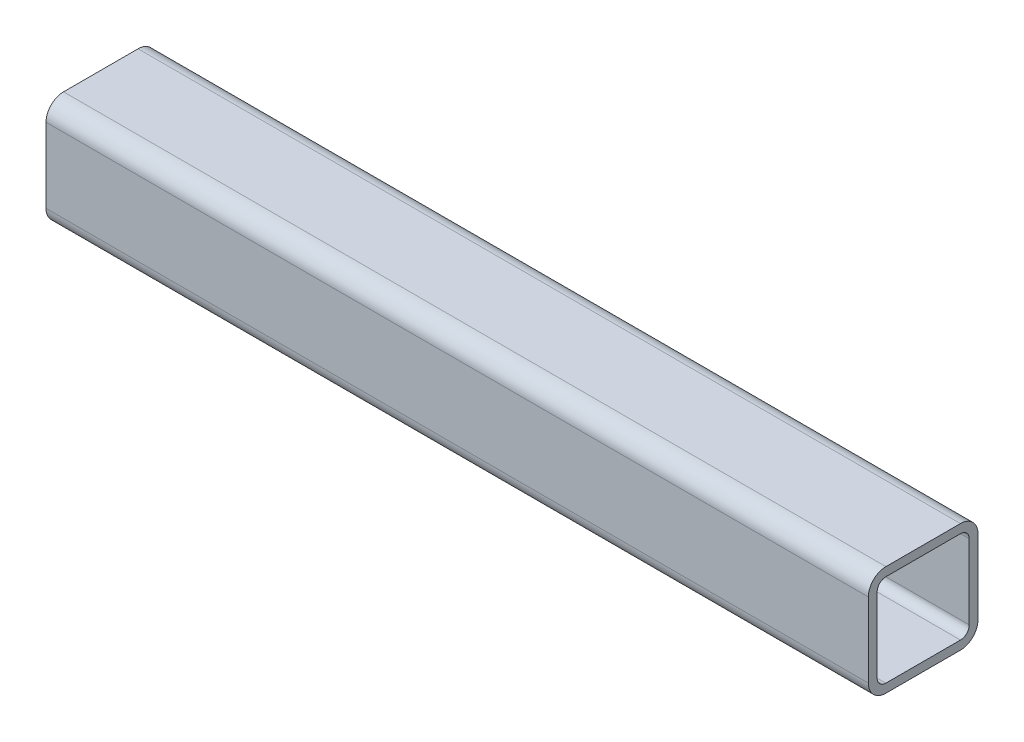
ISO-10303-21;
HEADER;
FILE_DESCRIPTION(('STEP AP214'),'2;1');
FILE_NAME('part.step','',(''),(''),'','','');
FILE_SCHEMA(('AUTOMOTIVE_DESIGN { 1 0 10303 214 1 1 1 1 }'));
ENDSEC;
DATA;
#1=APPLICATION_CONTEXT('core data for automotive mechanical design processes');
#2=APPLICATION_PROTOCOL_DEFINITION('international standard','automotive_design',2000,#1);
#3=PRODUCT_CONTEXT('',#1,'mechanical');
#4=PRODUCT('Part','Part','',(#3));
#5=PRODUCT_RELATED_PRODUCT_CATEGORY('part','',(#4));
#6=PRODUCT_DEFINITION_FORMATION('','',#4);
#7=PRODUCT_DEFINITION_CONTEXT('part definition',#1,'design');
#8=PRODUCT_DEFINITION('design','',#6,#7);
#9=PRODUCT_DEFINITION_SHAPE('','',#8);
#10=(LENGTH_UNIT() NAMED_UNIT(*) SI_UNIT(.MILLI.,.METRE.));
#11=(NAMED_UNIT(*) PLANE_ANGLE_UNIT() SI_UNIT($,.RADIAN.));
#12=(NAMED_UNIT(*) SI_UNIT($,.STERADIAN.) SOLID_ANGLE_UNIT());
#13=UNCERTAINTY_MEASURE_WITH_UNIT(LENGTH_MEASURE(1.E-05),#10,'distance_accuracy_value','');
#14=(GEOMETRIC_REPRESENTATION_CONTEXT(3) GLOBAL_UNCERTAINTY_ASSIGNED_CONTEXT((#13)) GLOBAL_UNIT_ASSIGNED_CONTEXT((#10,
#11,#12)) REPRESENTATION_CONTEXT('',''));
#15=CARTESIAN_POINT('',(0.,0.,0.));
#16=DIRECTION('',(0.,0.,1.));
#17=DIRECTION('',(1.,0.,0.));
#18=AXIS2_PLACEMENT_3D('',#15,#16,#17);
#19=CARTESIAN_POINT('',(300.,13.6,-13.6));
#20=DIRECTION('',(-1.,0.,0.));
#21=DIRECTION('',(0.,0.,1.));
#22=AXIS2_PLACEMENT_3D('',#19,#20,#21);
#23=CYLINDRICAL_SURFACE('',#22,6.4);
#24=CARTESIAN_POINT('',(0.,13.6,-13.6));
#25=DIRECTION('',(1.,0.,0.));
#26=DIRECTION('',(0.,0.,-1.));
#27=AXIS2_PLACEMENT_3D('',#24,#25,#26);
#28=CIRCLE('',#27,6.4);
#29=CARTESIAN_POINT('',(0.,13.6,-20.));
#30=VERTEX_POINT('',#29);
#31=CARTESIAN_POINT('',(0.,20.,-13.6));
#32=VERTEX_POINT('',#31);
#33=EDGE_CURVE('E234',#30,#32,#28,.T.);
#34=ORIENTED_EDGE('',*,*,#33,.T.);
#35=DIRECTION('',(-1.,0.,0.));
#36=VECTOR('',#35,1.);
#37=CARTESIAN_POINT('',(300.,20.,-13.6));
#38=LINE('',#37,#36);
#39=CARTESIAN_POINT('',(300.,20.,-13.6));
#40=VERTEX_POINT('',#39);
#41=EDGE_CURVE('E12',#40,#32,#38,.T.);
#42=ORIENTED_EDGE('',*,*,#41,.F.);
#43=CARTESIAN_POINT('',(300.,13.6,-13.6));
#44=DIRECTION('',(1.,0.,0.));
#45=DIRECTION('',(0.,0.,-1.));
#46=AXIS2_PLACEMENT_3D('',#43,#44,#45);
#47=CIRCLE('',#46,6.4);
#48=CARTESIAN_POINT('',(300.,13.6,-20.));
#49=VERTEX_POINT('',#48);
#50=EDGE_CURVE('E312',#49,#40,#47,.T.);
#51=ORIENTED_EDGE('',*,*,#50,.F.);
#52=DIRECTION('',(-1.,0.,0.));
#53=VECTOR('',#52,1.);
#54=CARTESIAN_POINT('',(300.,13.6,-20.));
#55=LINE('',#54,#53);
#56=EDGE_CURVE('E249',#49,#30,#55,.T.);
#57=ORIENTED_EDGE('',*,*,#56,.T.);
#58=EDGE_LOOP('',(#34,#42,#51,#57));
#59=FACE_BOUND('',#58,.T.);
#60=ADVANCED_FACE('F62',(#59),#23,.T.);
#61=CARTESIAN_POINT('',(300.,20.,-13.6));
#62=DIRECTION('',(0.,-1.,0.));
#63=DIRECTION('',(0.,0.,-1.));
#64=AXIS2_PLACEMENT_3D('',#61,#62,#63);
#65=PLANE('',#64);
#66=DIRECTION('',(0.,0.,1.));
#67=VECTOR('',#66,1.);
#68=CARTESIAN_POINT('',(0.,20.,-13.6));
#69=LINE('',#68,#67);
#70=CARTESIAN_POINT('',(0.,20.,13.6));
#71=VERTEX_POINT('',#70);
#72=EDGE_CURVE('E237',#32,#71,#69,.T.);
#73=ORIENTED_EDGE('',*,*,#72,.T.);
#74=DIRECTION('',(-1.,0.,0.));
#75=VECTOR('',#74,1.);
#76=CARTESIAN_POINT('',(300.,20.,13.6));
#77=LINE('',#76,#75);
#78=CARTESIAN_POINT('',(300.,20.,13.6));
#79=VERTEX_POINT('',#78);
#80=EDGE_CURVE('E72',#79,#71,#77,.T.);
#81=ORIENTED_EDGE('',*,*,#80,.F.);
#82=DIRECTION('',(0.,0.,1.));
#83=VECTOR('',#82,1.);
#84=CARTESIAN_POINT('',(300.,20.,-13.6));
#85=LINE('',#84,#83);
#86=EDGE_CURVE('E314',#40,#79,#85,.T.);
#87=ORIENTED_EDGE('',*,*,#86,.F.);
#88=ORIENTED_EDGE('',*,*,#41,.T.);
#89=EDGE_LOOP('',(#73,#81,#87,#88));
#90=FACE_BOUND('',#89,.T.);
#91=ADVANCED_FACE('F349',(#90),#65,.F.);
#92=CARTESIAN_POINT('',(300.,13.6,13.6));
#93=DIRECTION('',(-1.,0.,0.));
#94=DIRECTION('',(0.,0.,1.));
#95=AXIS2_PLACEMENT_3D('',#92,#93,#94);
#96=CYLINDRICAL_SURFACE('',#95,6.4);
#97=CARTESIAN_POINT('',(0.,13.6,13.6));
#98=DIRECTION('',(1.,0.,0.));
#99=DIRECTION('',(0.,0.,-1.));
#100=AXIS2_PLACEMENT_3D('',#97,#98,#99);
#101=CIRCLE('',#100,6.4);
#102=CARTESIAN_POINT('',(0.,13.6,20.));
#103=VERTEX_POINT('',#102);
#104=EDGE_CURVE('E239',#71,#103,#101,.T.);
#105=ORIENTED_EDGE('',*,*,#104,.T.);
#106=DIRECTION('',(-1.,0.,0.));
#107=VECTOR('',#106,1.);
#108=CARTESIAN_POINT('',(300.,13.6,20.));
#109=LINE('',#108,#107);
#110=CARTESIAN_POINT('',(300.,13.6,20.));
#111=VERTEX_POINT('',#110);
#112=EDGE_CURVE('E256',#111,#103,#109,.T.);
#113=ORIENTED_EDGE('',*,*,#112,.F.);
#114=CARTESIAN_POINT('',(300.,13.6,13.6));
#115=DIRECTION('',(1.,0.,0.));
#116=DIRECTION('',(0.,0.,-1.));
#117=AXIS2_PLACEMENT_3D('',#114,#115,#116);
#118=CIRCLE('',#117,6.4);
#119=EDGE_CURVE('E316',#79,#111,#118,.T.);
#120=ORIENTED_EDGE('',*,*,#119,.F.);
#121=ORIENTED_EDGE('',*,*,#80,.T.);
#122=EDGE_LOOP('',(#105,#113,#120,#121));
#123=FACE_BOUND('',#122,.T.);
#124=ADVANCED_FACE('F354',(#123),#96,.T.);
#125=CARTESIAN_POINT('',(300.,-13.6,20.));
#126=DIRECTION('',(0.,0.,-1.));
#127=DIRECTION('',(0.,1.,0.));
#128=AXIS2_PLACEMENT_3D('',#125,#126,#127);
#129=PLANE('',#128);
#130=DIRECTION('',(0.,-1.,0.));
#131=VECTOR('',#130,1.);
#132=CARTESIAN_POINT('',(0.,-13.6,20.));
#133=LINE('',#132,#131);
#134=CARTESIAN_POINT('',(0.,-13.6,20.));
#135=VERTEX_POINT('',#134);
#136=EDGE_CURVE('E241',#103,#135,#133,.T.);
#137=ORIENTED_EDGE('',*,*,#136,.T.);
#138=DIRECTION('',(-1.,0.,0.));
#139=VECTOR('',#138,1.);
#140=CARTESIAN_POINT('',(300.,-13.6,20.));
#141=LINE('',#140,#139);
#142=CARTESIAN_POINT('',(300.,-13.6,20.));
#143=VERTEX_POINT('',#142);
#144=EDGE_CURVE('E253',#143,#135,#141,.T.);
#145=ORIENTED_EDGE('',*,*,#144,.F.);
#146=DIRECTION('',(0.,-1.,0.));
#147=VECTOR('',#146,1.);
#148=CARTESIAN_POINT('',(300.,-13.6,20.));
#149=LINE('',#148,#147);
#150=EDGE_CURVE('E318',#111,#143,#149,.T.);
#151=ORIENTED_EDGE('',*,*,#150,.F.);
#152=ORIENTED_EDGE('',*,*,#112,.T.);
#153=EDGE_LOOP('',(#137,#145,#151,#152));
#154=FACE_BOUND('',#153,.T.);
#155=ADVANCED_FACE('F324',(#154),#129,.F.);
#156=CARTESIAN_POINT('',(300.,-13.6,13.6));
#157=DIRECTION('',(-1.,0.,0.));
#158=DIRECTION('',(0.,0.,1.));
#159=AXIS2_PLACEMENT_3D('',#156,#157,#158);
#160=CYLINDRICAL_SURFACE('',#159,6.4);
#161=CARTESIAN_POINT('',(0.,-13.6,13.6));
#162=DIRECTION('',(1.,0.,0.));
#163=DIRECTION('',(0.,0.,-1.));
#164=AXIS2_PLACEMENT_3D('',#161,#162,#163);
#165=CIRCLE('',#164,6.4);
#166=CARTESIAN_POINT('',(0.,-20.,13.6));
#167=VERTEX_POINT('',#166);
#168=EDGE_CURVE('E243',#135,#167,#165,.T.);
#169=ORIENTED_EDGE('',*,*,#168,.T.);
#170=DIRECTION('',(-1.,0.,0.));
#171=VECTOR('',#170,1.);
#172=CARTESIAN_POINT('',(300.,-20.,13.6));
#173=LINE('',#172,#171);
#174=CARTESIAN_POINT('',(300.,-20.,13.6));
#175=VERTEX_POINT('',#174);
#176=EDGE_CURVE('E201',#175,#167,#173,.T.);
#177=ORIENTED_EDGE('',*,*,#176,.F.);
#178=CARTESIAN_POINT('',(300.,-13.6,13.6));
#179=DIRECTION('',(1.,0.,0.));
#180=DIRECTION('',(0.,0.,-1.));
#181=AXIS2_PLACEMENT_3D('',#178,#179,#180);
#182=CIRCLE('',#181,6.4);
#183=EDGE_CURVE('E192',#143,#175,#182,.T.);
#184=ORIENTED_EDGE('',*,*,#183,.F.);
#185=ORIENTED_EDGE('',*,*,#144,.T.);
#186=EDGE_LOOP('',(#169,#177,#184,#185));
#187=FACE_BOUND('',#186,.T.);
#188=ADVANCED_FACE('F328',(#187),#160,.T.);
#189=CARTESIAN_POINT('',(300.,-20.,13.6));
#190=DIRECTION('',(0.,1.,0.));
#191=DIRECTION('',(0.,0.,1.));
#192=AXIS2_PLACEMENT_3D('',#189,#190,#191);
#193=PLANE('',#192);
#194=DIRECTION('',(0.,0.,-1.));
#195=VECTOR('',#194,1.);
#196=CARTESIAN_POINT('',(0.,-20.,13.6));
#197=LINE('',#196,#195);
#198=CARTESIAN_POINT('',(0.,-20.,-13.6));
#199=VERTEX_POINT('',#198);
#200=EDGE_CURVE('E200',#167,#199,#197,.T.);
#201=ORIENTED_EDGE('',*,*,#200,.T.);
#202=DIRECTION('',(-1.,0.,0.));
#203=VECTOR('',#202,1.);
#204=CARTESIAN_POINT('',(300.,-20.,-13.6));
#205=LINE('',#204,#203);
#206=CARTESIAN_POINT('',(300.,-20.,-13.6));
#207=VERTEX_POINT('',#206);
#208=EDGE_CURVE('E197',#207,#199,#205,.T.);
#209=ORIENTED_EDGE('',*,*,#208,.F.);
#210=DIRECTION('',(0.,0.,-1.));
#211=VECTOR('',#210,1.);
#212=CARTESIAN_POINT('',(300.,-20.,13.6));
#213=LINE('',#212,#211);
#214=EDGE_CURVE('E186',#175,#207,#213,.T.);
#215=ORIENTED_EDGE('',*,*,#214,.F.);
#216=ORIENTED_EDGE('',*,*,#176,.T.);
#217=EDGE_LOOP('',(#201,#209,#215,#216));
#218=FACE_BOUND('',#217,.T.);
#219=ADVANCED_FACE('F198',(#218),#193,.F.);
#220=CARTESIAN_POINT('',(300.,-13.6,-13.6));
#221=DIRECTION('',(-1.,0.,0.));
#222=DIRECTION('',(0.,0.,1.));
#223=AXIS2_PLACEMENT_3D('',#220,#221,#222);
#224=CYLINDRICAL_SURFACE('',#223,6.4);
#225=CARTESIAN_POINT('',(0.,-13.6,-13.6));
#226=DIRECTION('',(1.,0.,0.));
#227=DIRECTION('',(0.,0.,-1.));
#228=AXIS2_PLACEMENT_3D('',#225,#226,#227);
#229=CIRCLE('',#228,6.4);
#230=CARTESIAN_POINT('',(0.,-13.6,-20.));
#231=VERTEX_POINT('',#230);
#232=EDGE_CURVE('E134',#199,#231,#229,.T.);
#233=ORIENTED_EDGE('',*,*,#232,.T.);
#234=DIRECTION('',(-1.,0.,0.));
#235=VECTOR('',#234,1.);
#236=CARTESIAN_POINT('',(300.,-13.6,-20.));
#237=LINE('',#236,#235);
#238=CARTESIAN_POINT('',(300.,-13.6,-20.));
#239=VERTEX_POINT('',#238);
#240=EDGE_CURVE('E202',#239,#231,#237,.T.);
#241=ORIENTED_EDGE('',*,*,#240,.F.);
#242=CARTESIAN_POINT('',(300.,-13.6,-13.6));
#243=DIRECTION('',(1.,0.,0.));
#244=DIRECTION('',(0.,0.,-1.));
#245=AXIS2_PLACEMENT_3D('',#242,#243,#244);
#246=CIRCLE('',#245,6.4);
#247=EDGE_CURVE('E190',#207,#239,#246,.T.);
#248=ORIENTED_EDGE('',*,*,#247,.F.);
#249=ORIENTED_EDGE('',*,*,#208,.T.);
#250=EDGE_LOOP('',(#233,#241,#248,#249));
#251=FACE_BOUND('',#250,.T.);
#252=ADVANCED_FACE('F204',(#251),#224,.T.);
#253=CARTESIAN_POINT('',(300.,13.6,13.6));
#254=DIRECTION('',(-1.,0.,0.));
#255=DIRECTION('',(0.,0.,1.));
#256=AXIS2_PLACEMENT_3D('',#253,#254,#255);
#257=CYLINDRICAL_SURFACE('',#256,3.2);
#258=CARTESIAN_POINT('',(0.,13.6,13.6));
#259=DIRECTION('',(1.,0.,0.));
#260=DIRECTION('',(0.,0.,-1.));
#261=AXIS2_PLACEMENT_3D('',#258,#259,#260);
#262=CIRCLE('',#261,3.2);
#263=CARTESIAN_POINT('',(0.,16.8,13.6));
#264=VERTEX_POINT('',#263);
#265=CARTESIAN_POINT('',(0.,13.6,16.8));
#266=VERTEX_POINT('',#265);
#267=EDGE_CURVE('E210',#264,#266,#262,.T.);
#268=ORIENTED_EDGE('',*,*,#267,.F.);
#269=DIRECTION('',(-1.,0.,0.));
#270=VECTOR('',#269,1.);
#271=CARTESIAN_POINT('',(300.,16.8,13.6));
#272=LINE('',#271,#270);
#273=CARTESIAN_POINT('',(300.,16.8,13.6));
#274=VERTEX_POINT('',#273);
#275=EDGE_CURVE('E66',#274,#264,#272,.T.);
#276=ORIENTED_EDGE('',*,*,#275,.F.);
#277=CARTESIAN_POINT('',(300.,13.6,13.6));
#278=DIRECTION('',(1.,0.,0.));
#279=DIRECTION('',(0.,0.,-1.));
#280=AXIS2_PLACEMENT_3D('',#277,#278,#279);
#281=CIRCLE('',#280,3.2);
#282=CARTESIAN_POINT('',(300.,13.6,16.8));
#283=VERTEX_POINT('',#282);
#284=EDGE_CURVE('E248',#274,#283,#281,.T.);
#285=ORIENTED_EDGE('',*,*,#284,.T.);
#286=DIRECTION('',(-1.,0.,0.));
#287=VECTOR('',#286,1.);
#288=CARTESIAN_POINT('',(300.,13.6,16.8));
#289=LINE('',#288,#287);
#290=EDGE_CURVE('E206',#283,#266,#289,.T.);
#291=ORIENTED_EDGE('',*,*,#290,.T.);
#292=EDGE_LOOP('',(#268,#276,#285,#291));
#293=FACE_BOUND('',#292,.T.);
#294=ADVANCED_FACE('F64',(#293),#257,.F.);
#295=CARTESIAN_POINT('',(300.,16.8,-13.6));
#296=DIRECTION('',(0.,-1.,0.));
#297=DIRECTION('',(0.,0.,-1.));
#298=AXIS2_PLACEMENT_3D('',#295,#296,#297);
#299=PLANE('',#298);
#300=DIRECTION('',(0.,0.,1.));
#301=VECTOR('',#300,1.);
#302=CARTESIAN_POINT('',(0.,16.8,-13.6));
#303=LINE('',#302,#301);
#304=CARTESIAN_POINT('',(0.,16.8,-13.6));
#305=VERTEX_POINT('',#304);
#306=EDGE_CURVE('E213',#305,#264,#303,.T.);
#307=ORIENTED_EDGE('',*,*,#306,.F.);
#308=DIRECTION('',(-1.,0.,0.));
#309=VECTOR('',#308,1.);
#310=CARTESIAN_POINT('',(300.,16.8,-13.6));
#311=LINE('',#310,#309);
#312=CARTESIAN_POINT('',(300.,16.8,-13.6));
#313=VERTEX_POINT('',#312);
#314=EDGE_CURVE('E271',#313,#305,#311,.T.);
#315=ORIENTED_EDGE('',*,*,#314,.F.);
#316=DIRECTION('',(0.,0.,1.));
#317=VECTOR('',#316,1.);
#318=CARTESIAN_POINT('',(300.,16.8,-13.6));
#319=LINE('',#318,#317);
#320=EDGE_CURVE('E280',#313,#274,#319,.T.);
#321=ORIENTED_EDGE('',*,*,#320,.T.);
#322=ORIENTED_EDGE('',*,*,#275,.T.);
#323=EDGE_LOOP('',(#307,#315,#321,#322));
#324=FACE_BOUND('',#323,.T.);
#325=ADVANCED_FACE('F278',(#324),#299,.T.);
#326=CARTESIAN_POINT('',(300.,13.6,-13.6));
#327=DIRECTION('',(-1.,0.,0.));
#328=DIRECTION('',(0.,0.,1.));
#329=AXIS2_PLACEMENT_3D('',#326,#327,#328);
#330=CYLINDRICAL_SURFACE('',#329,3.2);
#331=CARTESIAN_POINT('',(0.,13.6,-13.6));
#332=DIRECTION('',(1.,0.,0.));
#333=DIRECTION('',(0.,0.,-1.));
#334=AXIS2_PLACEMENT_3D('',#331,#332,#333);
#335=CIRCLE('',#334,3.2);
#336=CARTESIAN_POINT('',(0.,13.6,-16.8));
#337=VERTEX_POINT('',#336);
#338=EDGE_CURVE('E216',#337,#305,#335,.T.);
#339=ORIENTED_EDGE('',*,*,#338,.F.);
#340=DIRECTION('',(-1.,0.,0.));
#341=VECTOR('',#340,1.);
#342=CARTESIAN_POINT('',(300.,13.6,-16.8));
#343=LINE('',#342,#341);
#344=CARTESIAN_POINT('',(300.,13.6,-16.8));
#345=VERTEX_POINT('',#344);
#346=EDGE_CURVE('E270',#345,#337,#343,.T.);
#347=ORIENTED_EDGE('',*,*,#346,.F.);
#348=CARTESIAN_POINT('',(300.,13.6,-13.6));
#349=DIRECTION('',(1.,0.,0.));
#350=DIRECTION('',(0.,0.,-1.));
#351=AXIS2_PLACEMENT_3D('',#348,#349,#350);
#352=CIRCLE('',#351,3.2);
#353=EDGE_CURVE('E288',#345,#313,#352,.T.);
#354=ORIENTED_EDGE('',*,*,#353,.T.);
#355=ORIENTED_EDGE('',*,*,#314,.T.);
#356=EDGE_LOOP('',(#339,#347,#354,#355));
#357=FACE_BOUND('',#356,.T.);
#358=ADVANCED_FACE('F286',(#357),#330,.F.);
#359=CARTESIAN_POINT('',(300.,13.6,-16.8));
#360=DIRECTION('',(0.,0.,1.));
#361=DIRECTION('',(1.,0.,0.));
#362=AXIS2_PLACEMENT_3D('',#359,#360,#361);
#363=PLANE('',#362);
#364=DIRECTION('',(0.,1.,0.));
#365=VECTOR('',#364,1.);
#366=CARTESIAN_POINT('',(0.,13.6,-16.8));
#367=LINE('',#366,#365);
#368=CARTESIAN_POINT('',(0.,-13.6,-16.8));
#369=VERTEX_POINT('',#368);
#370=EDGE_CURVE('E219',#369,#337,#367,.T.);
#371=ORIENTED_EDGE('',*,*,#370,.F.);
#372=DIRECTION('',(-1.,0.,0.));
#373=VECTOR('',#372,1.);
#374=CARTESIAN_POINT('',(300.,-13.6,-16.8));
#375=LINE('',#374,#373);
#376=CARTESIAN_POINT('',(300.,-13.6,-16.8));
#377=VERTEX_POINT('',#376);
#378=EDGE_CURVE('E268',#377,#369,#375,.T.);
#379=ORIENTED_EDGE('',*,*,#378,.F.);
#380=DIRECTION('',(0.,1.,0.));
#381=VECTOR('',#380,1.);
#382=CARTESIAN_POINT('',(300.,13.6,-16.8));
#383=LINE('',#382,#381);
#384=EDGE_CURVE('E294',#377,#345,#383,.T.);
#385=ORIENTED_EDGE('',*,*,#384,.T.);
#386=ORIENTED_EDGE('',*,*,#346,.T.);
#387=EDGE_LOOP('',(#371,#379,#385,#386));
#388=FACE_BOUND('',#387,.T.);
#389=ADVANCED_FACE('F297',(#388),#363,.T.);
#390=CARTESIAN_POINT('',(300.,-13.6,-13.6));
#391=DIRECTION('',(-1.,0.,0.));
#392=DIRECTION('',(0.,0.,1.));
#393=AXIS2_PLACEMENT_3D('',#390,#391,#392);
#394=CYLINDRICAL_SURFACE('',#393,3.2);
#395=CARTESIAN_POINT('',(0.,-13.6,-13.6));
#396=DIRECTION('',(1.,0.,0.));
#397=DIRECTION('',(0.,0.,-1.));
#398=AXIS2_PLACEMENT_3D('',#395,#396,#397);
#399=CIRCLE('',#398,3.2);
#400=CARTESIAN_POINT('',(0.,-16.8,-13.6));
#401=VERTEX_POINT('',#400);
#402=EDGE_CURVE('E222',#401,#369,#399,.T.);
#403=ORIENTED_EDGE('',*,*,#402,.F.);
#404=DIRECTION('',(-1.,0.,0.));
#405=VECTOR('',#404,1.);
#406=CARTESIAN_POINT('',(300.,-16.8,-13.6));
#407=LINE('',#406,#405);
#408=CARTESIAN_POINT('',(300.,-16.8,-13.6));
#409=VERTEX_POINT('',#408);
#410=EDGE_CURVE('E266',#409,#401,#407,.T.);
#411=ORIENTED_EDGE('',*,*,#410,.F.);
#412=CARTESIAN_POINT('',(300.,-13.6,-13.6));
#413=DIRECTION('',(1.,0.,0.));
#414=DIRECTION('',(0.,0.,-1.));
#415=AXIS2_PLACEMENT_3D('',#412,#413,#414);
#416=CIRCLE('',#415,3.2);
#417=EDGE_CURVE('E298',#409,#377,#416,.T.);
#418=ORIENTED_EDGE('',*,*,#417,.T.);
#419=ORIENTED_EDGE('',*,*,#378,.T.);
#420=EDGE_LOOP('',(#403,#411,#418,#419));
#421=FACE_BOUND('',#420,.T.);
#422=ADVANCED_FACE('F365',(#421),#394,.F.);
#423=CARTESIAN_POINT('',(300.,-16.8,13.6));
#424=DIRECTION('',(0.,1.,0.));
#425=DIRECTION('',(0.,0.,1.));
#426=AXIS2_PLACEMENT_3D('',#423,#424,#425);
#427=PLANE('',#426);
#428=DIRECTION('',(0.,0.,-1.));
#429=VECTOR('',#428,1.);
#430=CARTESIAN_POINT('',(0.,-16.8,13.6));
#431=LINE('',#430,#429);
#432=CARTESIAN_POINT('',(0.,-16.8,13.6));
#433=VERTEX_POINT('',#432);
#434=EDGE_CURVE('E225',#433,#401,#431,.T.);
#435=ORIENTED_EDGE('',*,*,#434,.F.);
#436=DIRECTION('',(-1.,0.,0.));
#437=VECTOR('',#436,1.);
#438=CARTESIAN_POINT('',(300.,-16.8,13.6));
#439=LINE('',#438,#437);
#440=CARTESIAN_POINT('',(300.,-16.8,13.6));
#441=VERTEX_POINT('',#440);
#442=EDGE_CURVE('E264',#441,#433,#439,.T.);
#443=ORIENTED_EDGE('',*,*,#442,.F.);
#444=DIRECTION('',(0.,0.,-1.));
#445=VECTOR('',#444,1.);
#446=CARTESIAN_POINT('',(300.,-16.8,13.6));
#447=LINE('',#446,#445);
#448=EDGE_CURVE('E300',#441,#409,#447,.T.);
#449=ORIENTED_EDGE('',*,*,#448,.T.);
#450=ORIENTED_EDGE('',*,*,#410,.T.);
#451=EDGE_LOOP('',(#435,#443,#449,#450));
#452=FACE_BOUND('',#451,.T.);
#453=ADVANCED_FACE('F361',(#452),#427,.T.);
#454=CARTESIAN_POINT('',(300.,-13.6,13.6));
#455=DIRECTION('',(-1.,0.,0.));
#456=DIRECTION('',(0.,0.,1.));
#457=AXIS2_PLACEMENT_3D('',#454,#455,#456);
#458=CYLINDRICAL_SURFACE('',#457,3.2);
#459=CARTESIAN_POINT('',(0.,-13.6,13.6));
#460=DIRECTION('',(1.,0.,0.));
#461=DIRECTION('',(0.,0.,-1.));
#462=AXIS2_PLACEMENT_3D('',#459,#460,#461);
#463=CIRCLE('',#462,3.2);
#464=CARTESIAN_POINT('',(0.,-13.6,16.8));
#465=VERTEX_POINT('',#464);
#466=EDGE_CURVE('E228',#465,#433,#463,.T.);
#467=ORIENTED_EDGE('',*,*,#466,.F.);
#468=DIRECTION('',(-1.,0.,0.));
#469=VECTOR('',#468,1.);
#470=CARTESIAN_POINT('',(300.,-13.6,16.8));
#471=LINE('',#470,#469);
#472=CARTESIAN_POINT('',(300.,-13.6,16.8));
#473=VERTEX_POINT('',#472);
#474=EDGE_CURVE('E262',#473,#465,#471,.T.);
#475=ORIENTED_EDGE('',*,*,#474,.F.);
#476=CARTESIAN_POINT('',(300.,-13.6,13.6));
#477=DIRECTION('',(1.,0.,0.));
#478=DIRECTION('',(0.,0.,-1.));
#479=AXIS2_PLACEMENT_3D('',#476,#477,#478);
#480=CIRCLE('',#479,3.2);
#481=EDGE_CURVE('E306',#473,#441,#480,.T.);
#482=ORIENTED_EDGE('',*,*,#481,.T.);
#483=ORIENTED_EDGE('',*,*,#442,.T.);
#484=EDGE_LOOP('',(#467,#475,#482,#483));
#485=FACE_BOUND('',#484,.T.);
#486=ADVANCED_FACE('F343',(#485),#458,.F.);
#487=CARTESIAN_POINT('',(300.,-13.6,16.8));
#488=DIRECTION('',(0.,0.,-1.));
#489=DIRECTION('',(0.,1.,0.));
#490=AXIS2_PLACEMENT_3D('',#487,#488,#489);
#491=PLANE('',#490);
#492=DIRECTION('',(0.,-1.,0.));
#493=VECTOR('',#492,1.);
#494=CARTESIAN_POINT('',(0.,-13.6,16.8));
#495=LINE('',#494,#493);
#496=EDGE_CURVE('E231',#266,#465,#495,.T.);
#497=ORIENTED_EDGE('',*,*,#496,.F.);
#498=ORIENTED_EDGE('',*,*,#290,.F.);
#499=DIRECTION('',(0.,-1.,0.));
#500=VECTOR('',#499,1.);
#501=CARTESIAN_POINT('',(300.,-13.6,16.8));
#502=LINE('',#501,#500);
#503=EDGE_CURVE('E309',#283,#473,#502,.T.);
#504=ORIENTED_EDGE('',*,*,#503,.T.);
#505=ORIENTED_EDGE('',*,*,#474,.T.);
#506=EDGE_LOOP('',(#497,#498,#504,#505));
#507=FACE_BOUND('',#506,.T.);
#508=ADVANCED_FACE('F336',(#507),#491,.T.);
#509=CARTESIAN_POINT('',(300.,13.6,-20.));
#510=DIRECTION('',(0.,0.,1.));
#511=DIRECTION('',(1.,0.,0.));
#512=AXIS2_PLACEMENT_3D('',#509,#510,#511);
#513=PLANE('',#512);
#514=DIRECTION('',(0.,1.,0.));
#515=VECTOR('',#514,1.);
#516=CARTESIAN_POINT('',(0.,13.6,-20.));
#517=LINE('',#516,#515);
#518=EDGE_CURVE('E140',#231,#30,#517,.T.);
#519=ORIENTED_EDGE('',*,*,#518,.T.);
#520=ORIENTED_EDGE('',*,*,#56,.F.);
#521=DIRECTION('',(0.,1.,0.));
#522=VECTOR('',#521,1.);
#523=CARTESIAN_POINT('',(300.,13.6,-20.));
#524=LINE('',#523,#522);
#525=EDGE_CURVE('E81',#239,#49,#524,.T.);
#526=ORIENTED_EDGE('',*,*,#525,.F.);
#527=ORIENTED_EDGE('',*,*,#240,.T.);
#528=EDGE_LOOP('',(#519,#520,#526,#527));
#529=FACE_BOUND('',#528,.T.);
#530=ADVANCED_FACE('F334',(#529),#513,.F.);
#531=CARTESIAN_POINT('',(300.,13.6,-13.6));
#532=DIRECTION('',(1.,0.,0.));
#533=DIRECTION('',(0.,0.,-1.));
#534=AXIS2_PLACEMENT_3D('',#531,#532,#533);
#535=PLANE('',#534);
#536=ORIENTED_EDGE('',*,*,#284,.F.);
#537=ORIENTED_EDGE('',*,*,#320,.F.);
#538=ORIENTED_EDGE('',*,*,#353,.F.);
#539=ORIENTED_EDGE('',*,*,#384,.F.);
#540=ORIENTED_EDGE('',*,*,#417,.F.);
#541=ORIENTED_EDGE('',*,*,#448,.F.);
#542=ORIENTED_EDGE('',*,*,#481,.F.);
#543=ORIENTED_EDGE('',*,*,#503,.F.);
#544=EDGE_LOOP('',(#536,#537,#538,#539,#540,#541,#542,#543));
#545=FACE_BOUND('',#544,.T.);
#546=ORIENTED_EDGE('',*,*,#50,.T.);
#547=ORIENTED_EDGE('',*,*,#86,.T.);
#548=ORIENTED_EDGE('',*,*,#119,.T.);
#549=ORIENTED_EDGE('',*,*,#150,.T.);
#550=ORIENTED_EDGE('',*,*,#183,.T.);
#551=ORIENTED_EDGE('',*,*,#214,.T.);
#552=ORIENTED_EDGE('',*,*,#247,.T.);
#553=ORIENTED_EDGE('',*,*,#525,.T.);
#554=EDGE_LOOP('',(#546,#547,#548,#549,#550,#551,#552,#553));
#555=FACE_BOUND('',#554,.T.);
#556=ADVANCED_FACE('F188',(#545,#555),#535,.T.);
#557=CARTESIAN_POINT('',(0.,13.6,-13.6));
#558=DIRECTION('',(1.,0.,0.));
#559=DIRECTION('',(0.,0.,-1.));
#560=AXIS2_PLACEMENT_3D('',#557,#558,#559);
#561=PLANE('',#560);
#562=ORIENTED_EDGE('',*,*,#267,.T.);
#563=ORIENTED_EDGE('',*,*,#496,.T.);
#564=ORIENTED_EDGE('',*,*,#466,.T.);
#565=ORIENTED_EDGE('',*,*,#434,.T.);
#566=ORIENTED_EDGE('',*,*,#402,.T.);
#567=ORIENTED_EDGE('',*,*,#370,.T.);
#568=ORIENTED_EDGE('',*,*,#338,.T.);
#569=ORIENTED_EDGE('',*,*,#306,.T.);
#570=EDGE_LOOP('',(#562,#563,#564,#565,#566,#567,#568,#569));
#571=FACE_BOUND('',#570,.T.);
#572=ORIENTED_EDGE('',*,*,#33,.F.);
#573=ORIENTED_EDGE('',*,*,#518,.F.);
#574=ORIENTED_EDGE('',*,*,#232,.F.);
#575=ORIENTED_EDGE('',*,*,#200,.F.);
#576=ORIENTED_EDGE('',*,*,#168,.F.);
#577=ORIENTED_EDGE('',*,*,#136,.F.);
#578=ORIENTED_EDGE('',*,*,#104,.F.);
#579=ORIENTED_EDGE('',*,*,#72,.F.);
#580=EDGE_LOOP('',(#572,#573,#574,#575,#576,#577,#578,#579));
#581=FACE_BOUND('',#580,.T.);
#582=ADVANCED_FACE('F283',(#571,#581),#561,.F.);
#583=CLOSED_SHELL('',(#60,#91,#124,#155,#188,#219,#252,#294,#325,#358,#389,#422,#453,#486,#508,
#530,#556,#582));
#584=MANIFOLD_SOLID_BREP('B2',#583);
#585=ADVANCED_BREP_SHAPE_REPRESENTATION('',(#18,#584),#14);
#586=SHAPE_DEFINITION_REPRESENTATION(#9,#585);
ENDSEC;
END-ISO-10303-21;
